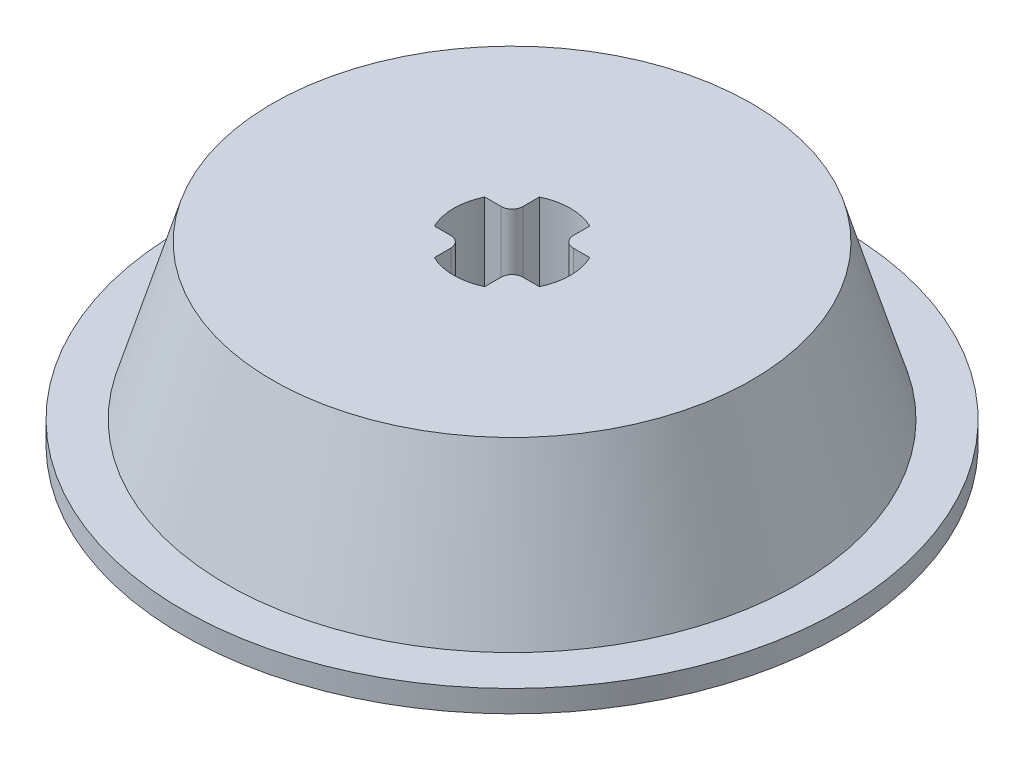
ISO-10303-21;
HEADER;
FILE_DESCRIPTION(('STEP AP214'),'2;1');
FILE_NAME('part.step','',(''),(''),'','','');
FILE_SCHEMA(('AUTOMOTIVE_DESIGN { 1 0 10303 214 1 1 1 1 }'));
ENDSEC;
DATA;
#1=APPLICATION_CONTEXT('core data for automotive mechanical design processes');
#2=APPLICATION_PROTOCOL_DEFINITION('international standard','automotive_design',2000,#1);
#3=PRODUCT_CONTEXT('',#1,'mechanical');
#4=PRODUCT('Part','Part','',(#3));
#5=PRODUCT_RELATED_PRODUCT_CATEGORY('part','',(#4));
#6=PRODUCT_DEFINITION_FORMATION('','',#4);
#7=PRODUCT_DEFINITION_CONTEXT('part definition',#1,'design');
#8=PRODUCT_DEFINITION('design','',#6,#7);
#9=PRODUCT_DEFINITION_SHAPE('','',#8);
#10=(LENGTH_UNIT() NAMED_UNIT(*) SI_UNIT(.MILLI.,.METRE.));
#11=(NAMED_UNIT(*) PLANE_ANGLE_UNIT() SI_UNIT($,.RADIAN.));
#12=(NAMED_UNIT(*) SI_UNIT($,.STERADIAN.) SOLID_ANGLE_UNIT());
#13=UNCERTAINTY_MEASURE_WITH_UNIT(LENGTH_MEASURE(1.E-05),#10,'distance_accuracy_value','');
#14=(GEOMETRIC_REPRESENTATION_CONTEXT(3) GLOBAL_UNCERTAINTY_ASSIGNED_CONTEXT((#13)) GLOBAL_UNIT_ASSIGNED_CONTEXT((#10,
#11,#12)) REPRESENTATION_CONTEXT('',''));
#15=CARTESIAN_POINT('',(0.,0.,0.));
#16=DIRECTION('',(0.,0.,1.));
#17=DIRECTION('',(1.,0.,0.));
#18=AXIS2_PLACEMENT_3D('',#15,#16,#17);
#19=CARTESIAN_POINT('',(0.,7.,0.));
#20=DIRECTION('',(0.,1.,0.));
#21=DIRECTION('',(0.,0.,1.));
#22=AXIS2_PLACEMENT_3D('',#19,#20,#21);
#23=PLANE('',#22);
#24=CARTESIAN_POINT('',(0.,7.,0.));
#25=DIRECTION('',(0.,-1.,0.));
#26=DIRECTION('',(0.,0.,-1.));
#27=AXIS2_PLACEMENT_3D('',#24,#25,#26);
#28=CIRCLE('',#27,10.9078870292361);
#29=CARTESIAN_POINT('',(0.,7.,-10.9078870292361));
#30=VERTEX_POINT('',#29);
#31=EDGE_CURVE('E253',#30,#30,#28,.T.);
#32=ORIENTED_EDGE('',*,*,#31,.F.);
#33=EDGE_LOOP('',(#32));
#34=FACE_BOUND('',#33,.T.);
#35=DIRECTION('',(1.,0.,0.));
#36=VECTOR('',#35,1.);
#37=CARTESIAN_POINT('',(0.,7.,1.145));
#38=LINE('',#37,#36);
#39=CARTESIAN_POINT('',(1.645,7.,1.14500000000001));
#40=VERTEX_POINT('',#39);
#41=CARTESIAN_POINT('',(2.38986924328508,7.,1.14500000000001));
#42=VERTEX_POINT('',#41);
#43=EDGE_CURVE('E193',#40,#42,#38,.T.);
#44=ORIENTED_EDGE('',*,*,#43,.F.);
#45=CARTESIAN_POINT('',(1.645,7.,1.64500000000001));
#46=DIRECTION('',(0.,1.,0.));
#47=DIRECTION('',(0.,0.,1.));
#48=AXIS2_PLACEMENT_3D('',#45,#46,#47);
#49=CIRCLE('',#48,0.5);
#50=CARTESIAN_POINT('',(1.145,7.,1.64500000000001));
#51=VERTEX_POINT('',#50);
#52=EDGE_CURVE('E274',#40,#51,#49,.T.);
#53=ORIENTED_EDGE('',*,*,#52,.T.);
#54=DIRECTION('',(0.,0.,1.));
#55=VECTOR('',#54,1.);
#56=CARTESIAN_POINT('',(1.145,7.,0.));
#57=LINE('',#56,#55);
#58=CARTESIAN_POINT('',(1.145,7.,2.38986924328508));
#59=VERTEX_POINT('',#58);
#60=EDGE_CURVE('E195',#51,#59,#57,.T.);
#61=ORIENTED_EDGE('',*,*,#60,.T.);
#62=CARTESIAN_POINT('',(0.,7.,0.));
#63=DIRECTION('',(0.,-1.,0.));
#64=DIRECTION('',(0.,0.,-1.));
#65=AXIS2_PLACEMENT_3D('',#62,#63,#64);
#66=CIRCLE('',#65,2.65);
#67=CARTESIAN_POINT('',(-1.145,7.,2.38986924328508));
#68=VERTEX_POINT('',#67);
#69=EDGE_CURVE('E197',#59,#68,#66,.T.);
#70=ORIENTED_EDGE('',*,*,#69,.T.);
#71=DIRECTION('',(0.,0.,1.));
#72=VECTOR('',#71,1.);
#73=CARTESIAN_POINT('',(-1.145,7.,0.));
#74=LINE('',#73,#72);
#75=CARTESIAN_POINT('',(-1.145,7.,1.64499999999999));
#76=VERTEX_POINT('',#75);
#77=EDGE_CURVE('E177',#76,#68,#74,.T.);
#78=ORIENTED_EDGE('',*,*,#77,.F.);
#79=CARTESIAN_POINT('',(-1.645,7.,1.64499999999999));
#80=DIRECTION('',(0.,1.,0.));
#81=DIRECTION('',(0.,0.,1.));
#82=AXIS2_PLACEMENT_3D('',#79,#80,#81);
#83=CIRCLE('',#82,0.5);
#84=CARTESIAN_POINT('',(-1.645,7.,1.14499999999999));
#85=VERTEX_POINT('',#84);
#86=EDGE_CURVE('E269',#76,#85,#83,.T.);
#87=ORIENTED_EDGE('',*,*,#86,.T.);
#88=DIRECTION('',(1.,0.,0.));
#89=VECTOR('',#88,1.);
#90=CARTESIAN_POINT('',(0.,7.,1.145));
#91=LINE('',#90,#89);
#92=CARTESIAN_POINT('',(-2.38986924328509,7.,1.14499999999999));
#93=VERTEX_POINT('',#92);
#94=EDGE_CURVE('E175',#93,#85,#91,.T.);
#95=ORIENTED_EDGE('',*,*,#94,.F.);
#96=CARTESIAN_POINT('',(0.,7.,0.));
#97=DIRECTION('',(0.,-1.,0.));
#98=DIRECTION('',(0.,0.,-1.));
#99=AXIS2_PLACEMENT_3D('',#96,#97,#98);
#100=CIRCLE('',#99,2.65);
#101=CARTESIAN_POINT('',(-2.38986924328508,7.,-1.14500000000001));
#102=VERTEX_POINT('',#101);
#103=EDGE_CURVE('E154',#93,#102,#100,.T.);
#104=ORIENTED_EDGE('',*,*,#103,.T.);
#105=DIRECTION('',(1.,0.,0.));
#106=VECTOR('',#105,1.);
#107=CARTESIAN_POINT('',(0.,7.,-1.145));
#108=LINE('',#107,#106);
#109=CARTESIAN_POINT('',(-1.645,7.,-1.14500000000001));
#110=VERTEX_POINT('',#109);
#111=EDGE_CURVE('E165',#102,#110,#108,.T.);
#112=ORIENTED_EDGE('',*,*,#111,.T.);
#113=CARTESIAN_POINT('',(-1.645,7.,-1.64500000000001));
#114=DIRECTION('',(0.,1.,0.));
#115=DIRECTION('',(0.,0.,1.));
#116=AXIS2_PLACEMENT_3D('',#113,#114,#115);
#117=CIRCLE('',#116,0.5);
#118=CARTESIAN_POINT('',(-1.145,7.,-1.64500000000001));
#119=VERTEX_POINT('',#118);
#120=EDGE_CURVE('E271',#110,#119,#117,.T.);
#121=ORIENTED_EDGE('',*,*,#120,.T.);
#122=DIRECTION('',(0.,0.,1.));
#123=VECTOR('',#122,1.);
#124=CARTESIAN_POINT('',(-1.145,7.,0.));
#125=LINE('',#124,#123);
#126=CARTESIAN_POINT('',(-1.145,7.,-2.38986924328508));
#127=VERTEX_POINT('',#126);
#128=EDGE_CURVE('E170',#127,#119,#125,.T.);
#129=ORIENTED_EDGE('',*,*,#128,.F.);
#130=CARTESIAN_POINT('',(0.,7.,0.));
#131=DIRECTION('',(0.,-1.,0.));
#132=DIRECTION('',(0.,0.,-1.));
#133=AXIS2_PLACEMENT_3D('',#130,#131,#132);
#134=CIRCLE('',#133,2.65);
#135=CARTESIAN_POINT('',(1.145,7.,-2.38986924328508));
#136=VERTEX_POINT('',#135);
#137=EDGE_CURVE('E183',#127,#136,#134,.T.);
#138=ORIENTED_EDGE('',*,*,#137,.T.);
#139=DIRECTION('',(0.,0.,1.));
#140=VECTOR('',#139,1.);
#141=CARTESIAN_POINT('',(1.145,7.,0.));
#142=LINE('',#141,#140);
#143=CARTESIAN_POINT('',(1.145,7.,-1.64499999999999));
#144=VERTEX_POINT('',#143);
#145=EDGE_CURVE('E186',#136,#144,#142,.T.);
#146=ORIENTED_EDGE('',*,*,#145,.T.);
#147=CARTESIAN_POINT('',(1.645,7.,-1.64499999999999));
#148=DIRECTION('',(0.,1.,0.));
#149=DIRECTION('',(0.,0.,1.));
#150=AXIS2_PLACEMENT_3D('',#147,#148,#149);
#151=CIRCLE('',#150,0.5);
#152=CARTESIAN_POINT('',(1.645,7.,-1.14499999999999));
#153=VERTEX_POINT('',#152);
#154=EDGE_CURVE('E52',#144,#153,#151,.T.);
#155=ORIENTED_EDGE('',*,*,#154,.T.);
#156=DIRECTION('',(1.,0.,0.));
#157=VECTOR('',#156,1.);
#158=CARTESIAN_POINT('',(0.,7.,-1.145));
#159=LINE('',#158,#157);
#160=CARTESIAN_POINT('',(2.38986924328509,7.,-1.14499999999999));
#161=VERTEX_POINT('',#160);
#162=EDGE_CURVE('E188',#153,#161,#159,.T.);
#163=ORIENTED_EDGE('',*,*,#162,.T.);
#164=CARTESIAN_POINT('',(0.,7.,0.));
#165=DIRECTION('',(0.,-1.,0.));
#166=DIRECTION('',(0.,0.,-1.));
#167=AXIS2_PLACEMENT_3D('',#164,#165,#166);
#168=CIRCLE('',#167,2.65);
#169=EDGE_CURVE('E190',#161,#42,#168,.T.);
#170=ORIENTED_EDGE('',*,*,#169,.T.);
#171=EDGE_LOOP('',(#44,#53,#61,#70,#78,#87,#95,#104,#112,#121,#129,#138,#146,#155,#163,#170));
#172=FACE_BOUND('',#171,.T.);
#173=ADVANCED_FACE('F37',(#34,#172),#23,.T.);
#174=CARTESIAN_POINT('',(0.,-1.,0.));
#175=DIRECTION('',(0.,-1.,0.));
#176=DIRECTION('',(0.,0.,-1.));
#177=AXIS2_PLACEMENT_3D('',#174,#175,#176);
#178=PLANE('',#177);
#179=CARTESIAN_POINT('',(0.,-1.,0.));
#180=DIRECTION('',(0.,-1.,0.));
#181=DIRECTION('',(0.,0.,-1.));
#182=AXIS2_PLACEMENT_3D('',#179,#180,#181);
#183=CIRCLE('',#182,15.);
#184=CARTESIAN_POINT('',(0.,-1.,-15.));
#185=VERTEX_POINT('',#184);
#186=EDGE_CURVE('E245',#185,#185,#183,.T.);
#187=ORIENTED_EDGE('',*,*,#186,.T.);
#188=EDGE_LOOP('',(#187));
#189=FACE_BOUND('',#188,.T.);
#190=DIRECTION('',(0.,0.,1.));
#191=VECTOR('',#190,1.);
#192=CARTESIAN_POINT('',(1.145,-1.,0.));
#193=LINE('',#192,#191);
#194=CARTESIAN_POINT('',(1.145,-1.,1.64500000000001));
#195=VERTEX_POINT('',#194);
#196=CARTESIAN_POINT('',(1.145,-1.,2.38986924328508));
#197=VERTEX_POINT('',#196);
#198=EDGE_CURVE('E223',#195,#197,#193,.T.);
#199=ORIENTED_EDGE('',*,*,#198,.F.);
#200=CARTESIAN_POINT('',(1.645,-1.,1.64500000000001));
#201=DIRECTION('',(0.,-1.,0.));
#202=DIRECTION('',(0.,0.,-1.));
#203=AXIS2_PLACEMENT_3D('',#200,#201,#202);
#204=CIRCLE('',#203,0.5);
#205=CARTESIAN_POINT('',(1.645,-1.,1.14500000000001));
#206=VERTEX_POINT('',#205);
#207=EDGE_CURVE('E265',#195,#206,#204,.T.);
#208=ORIENTED_EDGE('',*,*,#207,.T.);
#209=DIRECTION('',(1.,0.,0.));
#210=VECTOR('',#209,1.);
#211=CARTESIAN_POINT('',(0.,-1.,1.145));
#212=LINE('',#211,#210);
#213=CARTESIAN_POINT('',(2.38986924328508,-1.,1.14500000000001));
#214=VERTEX_POINT('',#213);
#215=EDGE_CURVE('E221',#206,#214,#212,.T.);
#216=ORIENTED_EDGE('',*,*,#215,.T.);
#217=CARTESIAN_POINT('',(0.,-1.,0.));
#218=DIRECTION('',(0.,-1.,0.));
#219=DIRECTION('',(0.,0.,-1.));
#220=AXIS2_PLACEMENT_3D('',#217,#218,#219);
#221=CIRCLE('',#220,2.65);
#222=CARTESIAN_POINT('',(2.38986924328509,-1.,-1.14499999999999));
#223=VERTEX_POINT('',#222);
#224=EDGE_CURVE('E218',#223,#214,#221,.T.);
#225=ORIENTED_EDGE('',*,*,#224,.F.);
#226=DIRECTION('',(1.,0.,0.));
#227=VECTOR('',#226,1.);
#228=CARTESIAN_POINT('',(0.,-1.,-1.145));
#229=LINE('',#228,#227);
#230=CARTESIAN_POINT('',(1.645,-1.,-1.14499999999999));
#231=VERTEX_POINT('',#230);
#232=EDGE_CURVE('E216',#231,#223,#229,.T.);
#233=ORIENTED_EDGE('',*,*,#232,.F.);
#234=CARTESIAN_POINT('',(1.645,-1.,-1.64499999999999));
#235=DIRECTION('',(0.,-1.,0.));
#236=DIRECTION('',(0.,0.,-1.));
#237=AXIS2_PLACEMENT_3D('',#234,#235,#236);
#238=CIRCLE('',#237,0.5);
#239=CARTESIAN_POINT('',(1.145,-1.,-1.64499999999999));
#240=VERTEX_POINT('',#239);
#241=EDGE_CURVE('E263',#231,#240,#238,.T.);
#242=ORIENTED_EDGE('',*,*,#241,.T.);
#243=DIRECTION('',(0.,0.,1.));
#244=VECTOR('',#243,1.);
#245=CARTESIAN_POINT('',(1.145,-1.,0.));
#246=LINE('',#245,#244);
#247=CARTESIAN_POINT('',(1.145,-1.,-2.38986924328508));
#248=VERTEX_POINT('',#247);
#249=EDGE_CURVE('E214',#248,#240,#246,.T.);
#250=ORIENTED_EDGE('',*,*,#249,.F.);
#251=CARTESIAN_POINT('',(0.,-1.,0.));
#252=DIRECTION('',(0.,-1.,0.));
#253=DIRECTION('',(0.,0.,-1.));
#254=AXIS2_PLACEMENT_3D('',#251,#252,#253);
#255=CIRCLE('',#254,2.65);
#256=CARTESIAN_POINT('',(-1.145,-1.,-2.38986924328508));
#257=VERTEX_POINT('',#256);
#258=EDGE_CURVE('E211',#257,#248,#255,.T.);
#259=ORIENTED_EDGE('',*,*,#258,.F.);
#260=DIRECTION('',(0.,0.,1.));
#261=VECTOR('',#260,1.);
#262=CARTESIAN_POINT('',(-1.145,-1.,0.));
#263=LINE('',#262,#261);
#264=CARTESIAN_POINT('',(-1.145,-1.,-1.64500000000001));
#265=VERTEX_POINT('',#264);
#266=EDGE_CURVE('E208',#257,#265,#263,.T.);
#267=ORIENTED_EDGE('',*,*,#266,.T.);
#268=CARTESIAN_POINT('',(-1.645,-1.,-1.64500000000001));
#269=DIRECTION('',(0.,-1.,0.));
#270=DIRECTION('',(0.,0.,-1.));
#271=AXIS2_PLACEMENT_3D('',#268,#269,#270);
#272=CIRCLE('',#271,0.5);
#273=CARTESIAN_POINT('',(-1.645,-1.,-1.14500000000001));
#274=VERTEX_POINT('',#273);
#275=EDGE_CURVE('E261',#265,#274,#272,.T.);
#276=ORIENTED_EDGE('',*,*,#275,.T.);
#277=DIRECTION('',(1.,0.,0.));
#278=VECTOR('',#277,1.);
#279=CARTESIAN_POINT('',(0.,-1.,-1.145));
#280=LINE('',#279,#278);
#281=CARTESIAN_POINT('',(-2.38986924328508,-1.,-1.14500000000001));
#282=VERTEX_POINT('',#281);
#283=EDGE_CURVE('E206',#282,#274,#280,.T.);
#284=ORIENTED_EDGE('',*,*,#283,.F.);
#285=CARTESIAN_POINT('',(0.,-1.,0.));
#286=DIRECTION('',(0.,-1.,0.));
#287=DIRECTION('',(0.,0.,-1.));
#288=AXIS2_PLACEMENT_3D('',#285,#286,#287);
#289=CIRCLE('',#288,2.65);
#290=CARTESIAN_POINT('',(-2.38986924328509,-1.,1.14499999999999));
#291=VERTEX_POINT('',#290);
#292=EDGE_CURVE('E157',#291,#282,#289,.T.);
#293=ORIENTED_EDGE('',*,*,#292,.F.);
#294=DIRECTION('',(1.,0.,0.));
#295=VECTOR('',#294,1.);
#296=CARTESIAN_POINT('',(0.,-1.,1.145));
#297=LINE('',#296,#295);
#298=CARTESIAN_POINT('',(-1.645,-1.,1.14499999999999));
#299=VERTEX_POINT('',#298);
#300=EDGE_CURVE('E202',#291,#299,#297,.T.);
#301=ORIENTED_EDGE('',*,*,#300,.T.);
#302=CARTESIAN_POINT('',(-1.645,-1.,1.64499999999999));
#303=DIRECTION('',(0.,-1.,0.));
#304=DIRECTION('',(0.,0.,-1.));
#305=AXIS2_PLACEMENT_3D('',#302,#303,#304);
#306=CIRCLE('',#305,0.5);
#307=CARTESIAN_POINT('',(-1.145,-1.,1.64499999999999));
#308=VERTEX_POINT('',#307);
#309=EDGE_CURVE('E259',#299,#308,#306,.T.);
#310=ORIENTED_EDGE('',*,*,#309,.T.);
#311=DIRECTION('',(0.,0.,1.));
#312=VECTOR('',#311,1.);
#313=CARTESIAN_POINT('',(-1.145,-1.,0.));
#314=LINE('',#313,#312);
#315=CARTESIAN_POINT('',(-1.145,-1.,2.38986924328508));
#316=VERTEX_POINT('',#315);
#317=EDGE_CURVE('E200',#308,#316,#314,.T.);
#318=ORIENTED_EDGE('',*,*,#317,.T.);
#319=CARTESIAN_POINT('',(0.,-1.,0.));
#320=DIRECTION('',(0.,-1.,0.));
#321=DIRECTION('',(0.,0.,-1.));
#322=AXIS2_PLACEMENT_3D('',#319,#320,#321);
#323=CIRCLE('',#322,2.65);
#324=EDGE_CURVE('E225',#197,#316,#323,.T.);
#325=ORIENTED_EDGE('',*,*,#324,.F.);
#326=EDGE_LOOP('',(#199,#208,#216,#225,#233,#242,#250,#259,#267,#276,#284,#293,#301,#310,#318,#325));
#327=FACE_BOUND('',#326,.T.);
#328=ADVANCED_FACE('F292',(#189,#327),#178,.T.);
#329=CARTESIAN_POINT('',(0.,0.,0.));
#330=DIRECTION('',(0.,-1.,0.));
#331=DIRECTION('',(0.,0.,-1.));
#332=AXIS2_PLACEMENT_3D('',#329,#330,#331);
#333=CONICAL_SURFACE('',#332,13.,0.29042278753185);
#334=ORIENTED_EDGE('',*,*,#31,.T.);
#335=EDGE_LOOP('',(#334));
#336=FACE_BOUND('',#335,.T.);
#337=CARTESIAN_POINT('',(0.,0.,0.));
#338=DIRECTION('',(0.,-1.,0.));
#339=DIRECTION('',(0.,0.,-1.));
#340=AXIS2_PLACEMENT_3D('',#337,#338,#339);
#341=CIRCLE('',#340,13.);
#342=CARTESIAN_POINT('',(0.,0.,-13.));
#343=VERTEX_POINT('',#342);
#344=EDGE_CURVE('E248',#343,#343,#341,.T.);
#345=ORIENTED_EDGE('',*,*,#344,.F.);
#346=EDGE_LOOP('',(#345));
#347=FACE_BOUND('',#346,.T.);
#348=ADVANCED_FACE('F357',(#336,#347),#333,.T.);
#349=CARTESIAN_POINT('',(0.,-1.,0.));
#350=DIRECTION('',(0.,1.,0.));
#351=DIRECTION('',(0.,0.,1.));
#352=AXIS2_PLACEMENT_3D('',#349,#350,#351);
#353=CYLINDRICAL_SURFACE('',#352,15.);
#354=ORIENTED_EDGE('',*,*,#186,.F.);
#355=EDGE_LOOP('',(#354));
#356=FACE_BOUND('',#355,.T.);
#357=CARTESIAN_POINT('',(0.,0.,0.));
#358=DIRECTION('',(0.,-1.,0.));
#359=DIRECTION('',(0.,0.,-1.));
#360=AXIS2_PLACEMENT_3D('',#357,#358,#359);
#361=CIRCLE('',#360,15.);
#362=CARTESIAN_POINT('',(0.,0.,-15.));
#363=VERTEX_POINT('',#362);
#364=EDGE_CURVE('E231',#363,#363,#361,.T.);
#365=ORIENTED_EDGE('',*,*,#364,.T.);
#366=EDGE_LOOP('',(#365));
#367=FACE_BOUND('',#366,.T.);
#368=ADVANCED_FACE('F346',(#356,#367),#353,.T.);
#369=CARTESIAN_POINT('',(0.,0.,0.));
#370=DIRECTION('',(0.,-1.,0.));
#371=DIRECTION('',(0.,0.,-1.));
#372=AXIS2_PLACEMENT_3D('',#369,#370,#371);
#373=PLANE('',#372);
#374=ORIENTED_EDGE('',*,*,#344,.T.);
#375=EDGE_LOOP('',(#374));
#376=FACE_BOUND('',#375,.T.);
#377=ORIENTED_EDGE('',*,*,#364,.F.);
#378=EDGE_LOOP('',(#377));
#379=FACE_BOUND('',#378,.T.);
#380=ADVANCED_FACE('F339',(#376,#379),#373,.F.);
#381=CARTESIAN_POINT('',(-1.145,7.,0.));
#382=DIRECTION('',(1.,0.,0.));
#383=DIRECTION('',(0.,0.,-1.));
#384=AXIS2_PLACEMENT_3D('',#381,#382,#383);
#385=PLANE('',#384);
#386=ORIENTED_EDGE('',*,*,#317,.F.);
#387=DIRECTION('',(0.,-1.,0.));
#388=VECTOR('',#387,1.);
#389=CARTESIAN_POINT('',(-1.145,7.,1.64499999999999));
#390=LINE('',#389,#388);
#391=EDGE_CURVE('E11',#308,#76,#390,.F.);
#392=ORIENTED_EDGE('',*,*,#391,.T.);
#393=ORIENTED_EDGE('',*,*,#77,.T.);
#394=DIRECTION('',(0.,-1.,0.));
#395=VECTOR('',#394,1.);
#396=CARTESIAN_POINT('',(-1.145,7.,2.38986924328508));
#397=LINE('',#396,#395);
#398=EDGE_CURVE('E228',#68,#316,#397,.T.);
#399=ORIENTED_EDGE('',*,*,#398,.T.);
#400=EDGE_LOOP('',(#386,#392,#393,#399));
#401=FACE_BOUND('',#400,.T.);
#402=ADVANCED_FACE('F337',(#401),#385,.T.);
#403=CARTESIAN_POINT('',(0.,7.,0.));
#404=DIRECTION('',(0.,-1.,0.));
#405=DIRECTION('',(0.,0.,-1.));
#406=AXIS2_PLACEMENT_3D('',#403,#404,#405);
#407=CYLINDRICAL_SURFACE('',#406,2.65);
#408=ORIENTED_EDGE('',*,*,#324,.T.);
#409=ORIENTED_EDGE('',*,*,#398,.F.);
#410=ORIENTED_EDGE('',*,*,#69,.F.);
#411=DIRECTION('',(0.,-1.,0.));
#412=VECTOR('',#411,1.);
#413=CARTESIAN_POINT('',(1.145,7.,2.38986924328508));
#414=LINE('',#413,#412);
#415=EDGE_CURVE('E232',#59,#197,#414,.T.);
#416=ORIENTED_EDGE('',*,*,#415,.T.);
#417=EDGE_LOOP('',(#408,#409,#410,#416));
#418=FACE_BOUND('',#417,.T.);
#419=ADVANCED_FACE('F332',(#418),#407,.F.);
#420=CARTESIAN_POINT('',(1.145,7.,0.));
#421=DIRECTION('',(1.,0.,0.));
#422=DIRECTION('',(0.,0.,-1.));
#423=AXIS2_PLACEMENT_3D('',#420,#421,#422);
#424=PLANE('',#423);
#425=ORIENTED_EDGE('',*,*,#60,.F.);
#426=DIRECTION('',(0.,-1.,0.));
#427=VECTOR('',#426,1.);
#428=CARTESIAN_POINT('',(1.145,-1.,1.64500000000001));
#429=LINE('',#428,#427);
#430=EDGE_CURVE('E256',#51,#195,#429,.T.);
#431=ORIENTED_EDGE('',*,*,#430,.T.);
#432=ORIENTED_EDGE('',*,*,#198,.T.);
#433=ORIENTED_EDGE('',*,*,#415,.F.);
#434=EDGE_LOOP('',(#425,#431,#432,#433));
#435=FACE_BOUND('',#434,.T.);
#436=ADVANCED_FACE('F327',(#435),#424,.F.);
#437=CARTESIAN_POINT('',(0.,7.,1.145));
#438=DIRECTION('',(0.,0.,-1.));
#439=DIRECTION('',(-1.,0.,0.));
#440=AXIS2_PLACEMENT_3D('',#437,#438,#439);
#441=PLANE('',#440);
#442=ORIENTED_EDGE('',*,*,#215,.F.);
#443=DIRECTION('',(0.,-1.,0.));
#444=VECTOR('',#443,1.);
#445=CARTESIAN_POINT('',(1.645,7.,1.14500000000001));
#446=LINE('',#445,#444);
#447=EDGE_CURVE('E267',#206,#40,#446,.F.);
#448=ORIENTED_EDGE('',*,*,#447,.T.);
#449=ORIENTED_EDGE('',*,*,#43,.T.);
#450=DIRECTION('',(0.,-1.,0.));
#451=VECTOR('',#450,1.);
#452=CARTESIAN_POINT('',(2.38986924328508,7.,1.14500000000001));
#453=LINE('',#452,#451);
#454=EDGE_CURVE('E235',#42,#214,#453,.T.);
#455=ORIENTED_EDGE('',*,*,#454,.T.);
#456=EDGE_LOOP('',(#442,#448,#449,#455));
#457=FACE_BOUND('',#456,.T.);
#458=ADVANCED_FACE('F448',(#457),#441,.T.);
#459=CARTESIAN_POINT('',(0.,7.,0.));
#460=DIRECTION('',(0.,-1.,0.));
#461=DIRECTION('',(0.,0.,-1.));
#462=AXIS2_PLACEMENT_3D('',#459,#460,#461);
#463=CYLINDRICAL_SURFACE('',#462,2.65);
#464=ORIENTED_EDGE('',*,*,#224,.T.);
#465=ORIENTED_EDGE('',*,*,#454,.F.);
#466=ORIENTED_EDGE('',*,*,#169,.F.);
#467=DIRECTION('',(0.,-1.,0.));
#468=VECTOR('',#467,1.);
#469=CARTESIAN_POINT('',(2.38986924328509,7.,-1.14499999999999));
#470=LINE('',#469,#468);
#471=EDGE_CURVE('E238',#161,#223,#470,.T.);
#472=ORIENTED_EDGE('',*,*,#471,.T.);
#473=EDGE_LOOP('',(#464,#465,#466,#472));
#474=FACE_BOUND('',#473,.T.);
#475=ADVANCED_FACE('F317',(#474),#463,.F.);
#476=CARTESIAN_POINT('',(0.,7.,-1.145));
#477=DIRECTION('',(0.,0.,-1.));
#478=DIRECTION('',(-1.,0.,0.));
#479=AXIS2_PLACEMENT_3D('',#476,#477,#478);
#480=PLANE('',#479);
#481=ORIENTED_EDGE('',*,*,#162,.F.);
#482=DIRECTION('',(0.,-1.,0.));
#483=VECTOR('',#482,1.);
#484=CARTESIAN_POINT('',(1.645,7.,-1.14499999999999));
#485=LINE('',#484,#483);
#486=EDGE_CURVE('E276',#153,#231,#485,.T.);
#487=ORIENTED_EDGE('',*,*,#486,.T.);
#488=ORIENTED_EDGE('',*,*,#232,.T.);
#489=ORIENTED_EDGE('',*,*,#471,.F.);
#490=EDGE_LOOP('',(#481,#487,#488,#489));
#491=FACE_BOUND('',#490,.T.);
#492=ADVANCED_FACE('F310',(#491),#480,.F.);
#493=CARTESIAN_POINT('',(1.145,7.,0.));
#494=DIRECTION('',(1.,0.,0.));
#495=DIRECTION('',(0.,0.,-1.));
#496=AXIS2_PLACEMENT_3D('',#493,#494,#495);
#497=PLANE('',#496);
#498=ORIENTED_EDGE('',*,*,#249,.T.);
#499=DIRECTION('',(0.,-1.,0.));
#500=VECTOR('',#499,1.);
#501=CARTESIAN_POINT('',(1.145,7.,-1.64499999999999));
#502=LINE('',#501,#500);
#503=EDGE_CURVE('E60',#240,#144,#502,.F.);
#504=ORIENTED_EDGE('',*,*,#503,.T.);
#505=ORIENTED_EDGE('',*,*,#145,.F.);
#506=DIRECTION('',(0.,-1.,0.));
#507=VECTOR('',#506,1.);
#508=CARTESIAN_POINT('',(1.145,7.,-2.38986924328508));
#509=LINE('',#508,#507);
#510=EDGE_CURVE('E241',#136,#248,#509,.T.);
#511=ORIENTED_EDGE('',*,*,#510,.T.);
#512=EDGE_LOOP('',(#498,#504,#505,#511));
#513=FACE_BOUND('',#512,.T.);
#514=ADVANCED_FACE('F427',(#513),#497,.F.);
#515=CARTESIAN_POINT('',(0.,7.,0.));
#516=DIRECTION('',(0.,-1.,0.));
#517=DIRECTION('',(0.,0.,-1.));
#518=AXIS2_PLACEMENT_3D('',#515,#516,#517);
#519=CYLINDRICAL_SURFACE('',#518,2.65);
#520=ORIENTED_EDGE('',*,*,#258,.T.);
#521=ORIENTED_EDGE('',*,*,#510,.F.);
#522=ORIENTED_EDGE('',*,*,#137,.F.);
#523=DIRECTION('',(0.,-1.,0.));
#524=VECTOR('',#523,1.);
#525=CARTESIAN_POINT('',(-1.145,7.,-2.38986924328508));
#526=LINE('',#525,#524);
#527=EDGE_CURVE('E161',#127,#257,#526,.T.);
#528=ORIENTED_EDGE('',*,*,#527,.T.);
#529=EDGE_LOOP('',(#520,#521,#522,#528));
#530=FACE_BOUND('',#529,.T.);
#531=ADVANCED_FACE('F304',(#530),#519,.F.);
#532=CARTESIAN_POINT('',(-1.145,7.,0.));
#533=DIRECTION('',(1.,0.,0.));
#534=DIRECTION('',(0.,0.,-1.));
#535=AXIS2_PLACEMENT_3D('',#532,#533,#534);
#536=PLANE('',#535);
#537=ORIENTED_EDGE('',*,*,#128,.T.);
#538=DIRECTION('',(0.,-1.,0.));
#539=VECTOR('',#538,1.);
#540=CARTESIAN_POINT('',(-1.145,-1.,-1.64500000000001));
#541=LINE('',#540,#539);
#542=EDGE_CURVE('E280',#119,#265,#541,.T.);
#543=ORIENTED_EDGE('',*,*,#542,.T.);
#544=ORIENTED_EDGE('',*,*,#266,.F.);
#545=ORIENTED_EDGE('',*,*,#527,.F.);
#546=EDGE_LOOP('',(#537,#543,#544,#545));
#547=FACE_BOUND('',#546,.T.);
#548=ADVANCED_FACE('F299',(#547),#536,.T.);
#549=CARTESIAN_POINT('',(0.,7.,-1.145));
#550=DIRECTION('',(0.,0.,-1.));
#551=DIRECTION('',(-1.,0.,0.));
#552=AXIS2_PLACEMENT_3D('',#549,#550,#551);
#553=PLANE('',#552);
#554=ORIENTED_EDGE('',*,*,#283,.T.);
#555=DIRECTION('',(0.,-1.,0.));
#556=VECTOR('',#555,1.);
#557=CARTESIAN_POINT('',(-1.645,7.,-1.14500000000001));
#558=LINE('',#557,#556);
#559=EDGE_CURVE('E168',#274,#110,#558,.F.);
#560=ORIENTED_EDGE('',*,*,#559,.T.);
#561=ORIENTED_EDGE('',*,*,#111,.F.);
#562=DIRECTION('',(0.,-1.,0.));
#563=VECTOR('',#562,1.);
#564=CARTESIAN_POINT('',(-2.38986924328508,7.,-1.14500000000001));
#565=LINE('',#564,#563);
#566=EDGE_CURVE('E150',#102,#282,#565,.T.);
#567=ORIENTED_EDGE('',*,*,#566,.T.);
#568=EDGE_LOOP('',(#554,#560,#561,#567));
#569=FACE_BOUND('',#568,.T.);
#570=ADVANCED_FACE('F166',(#569),#553,.F.);
#571=CARTESIAN_POINT('',(0.,7.,0.));
#572=DIRECTION('',(0.,-1.,0.));
#573=DIRECTION('',(0.,0.,-1.));
#574=AXIS2_PLACEMENT_3D('',#571,#572,#573);
#575=CYLINDRICAL_SURFACE('',#574,2.65);
#576=ORIENTED_EDGE('',*,*,#292,.T.);
#577=ORIENTED_EDGE('',*,*,#566,.F.);
#578=ORIENTED_EDGE('',*,*,#103,.F.);
#579=DIRECTION('',(0.,-1.,0.));
#580=VECTOR('',#579,1.);
#581=CARTESIAN_POINT('',(-2.38986924328509,7.,1.14499999999999));
#582=LINE('',#581,#580);
#583=EDGE_CURVE('E162',#93,#291,#582,.T.);
#584=ORIENTED_EDGE('',*,*,#583,.T.);
#585=EDGE_LOOP('',(#576,#577,#578,#584));
#586=FACE_BOUND('',#585,.T.);
#587=ADVANCED_FACE('F152',(#586),#575,.F.);
#588=CARTESIAN_POINT('',(0.,7.,1.145));
#589=DIRECTION('',(0.,0.,-1.));
#590=DIRECTION('',(-1.,0.,0.));
#591=AXIS2_PLACEMENT_3D('',#588,#589,#590);
#592=PLANE('',#591);
#593=ORIENTED_EDGE('',*,*,#94,.T.);
#594=DIRECTION('',(0.,-1.,0.));
#595=VECTOR('',#594,1.);
#596=CARTESIAN_POINT('',(-1.645,7.,1.14499999999999));
#597=LINE('',#596,#595);
#598=EDGE_CURVE('E45',#85,#299,#597,.T.);
#599=ORIENTED_EDGE('',*,*,#598,.T.);
#600=ORIENTED_EDGE('',*,*,#300,.F.);
#601=ORIENTED_EDGE('',*,*,#583,.F.);
#602=EDGE_LOOP('',(#593,#599,#600,#601));
#603=FACE_BOUND('',#602,.T.);
#604=ADVANCED_FACE('F287',(#603),#592,.T.);
#605=CARTESIAN_POINT('',(1.645,7.,1.64500000000001));
#606=DIRECTION('',(0.,1.,0.));
#607=DIRECTION('',(0.,0.,1.));
#608=AXIS2_PLACEMENT_3D('',#605,#606,#607);
#609=CYLINDRICAL_SURFACE('',#608,0.5);
#610=ORIENTED_EDGE('',*,*,#52,.F.);
#611=ORIENTED_EDGE('',*,*,#447,.F.);
#612=ORIENTED_EDGE('',*,*,#207,.F.);
#613=ORIENTED_EDGE('',*,*,#430,.F.);
#614=EDGE_LOOP('',(#610,#611,#612,#613));
#615=FACE_BOUND('',#614,.T.);
#616=ADVANCED_FACE('F325',(#615),#609,.T.);
#617=CARTESIAN_POINT('',(1.645,7.,-1.64499999999999));
#618=DIRECTION('',(0.,-1.,0.));
#619=DIRECTION('',(0.,0.,-1.));
#620=AXIS2_PLACEMENT_3D('',#617,#618,#619);
#621=CYLINDRICAL_SURFACE('',#620,0.5);
#622=ORIENTED_EDGE('',*,*,#154,.F.);
#623=ORIENTED_EDGE('',*,*,#503,.F.);
#624=ORIENTED_EDGE('',*,*,#241,.F.);
#625=ORIENTED_EDGE('',*,*,#486,.F.);
#626=EDGE_LOOP('',(#622,#623,#624,#625));
#627=FACE_BOUND('',#626,.T.);
#628=ADVANCED_FACE('F307',(#627),#621,.T.);
#629=CARTESIAN_POINT('',(-1.645,7.,-1.64500000000001));
#630=DIRECTION('',(0.,1.,0.));
#631=DIRECTION('',(0.,0.,1.));
#632=AXIS2_PLACEMENT_3D('',#629,#630,#631);
#633=CYLINDRICAL_SURFACE('',#632,0.5);
#634=ORIENTED_EDGE('',*,*,#120,.F.);
#635=ORIENTED_EDGE('',*,*,#559,.F.);
#636=ORIENTED_EDGE('',*,*,#275,.F.);
#637=ORIENTED_EDGE('',*,*,#542,.F.);
#638=EDGE_LOOP('',(#634,#635,#636,#637));
#639=FACE_BOUND('',#638,.T.);
#640=ADVANCED_FACE('F295',(#639),#633,.T.);
#641=CARTESIAN_POINT('',(-1.645,7.,1.64499999999999));
#642=DIRECTION('',(0.,-1.,0.));
#643=DIRECTION('',(0.,0.,-1.));
#644=AXIS2_PLACEMENT_3D('',#641,#642,#643);
#645=CYLINDRICAL_SURFACE('',#644,0.5);
#646=ORIENTED_EDGE('',*,*,#86,.F.);
#647=ORIENTED_EDGE('',*,*,#391,.F.);
#648=ORIENTED_EDGE('',*,*,#309,.F.);
#649=ORIENTED_EDGE('',*,*,#598,.F.);
#650=EDGE_LOOP('',(#646,#647,#648,#649));
#651=FACE_BOUND('',#650,.T.);
#652=ADVANCED_FACE('F39',(#651),#645,.T.);
#653=CLOSED_SHELL('',(#173,#328,#348,#368,#380,#402,#419,#436,#458,#475,#492,#514,#531,#548,
#570,#587,#604,#616,#628,#640,#652));
#654=MANIFOLD_SOLID_BREP('B2',#653);
#655=ADVANCED_BREP_SHAPE_REPRESENTATION('',(#18,#654),#14);
#656=SHAPE_DEFINITION_REPRESENTATION(#9,#655);
ENDSEC;
END-ISO-10303-21;
